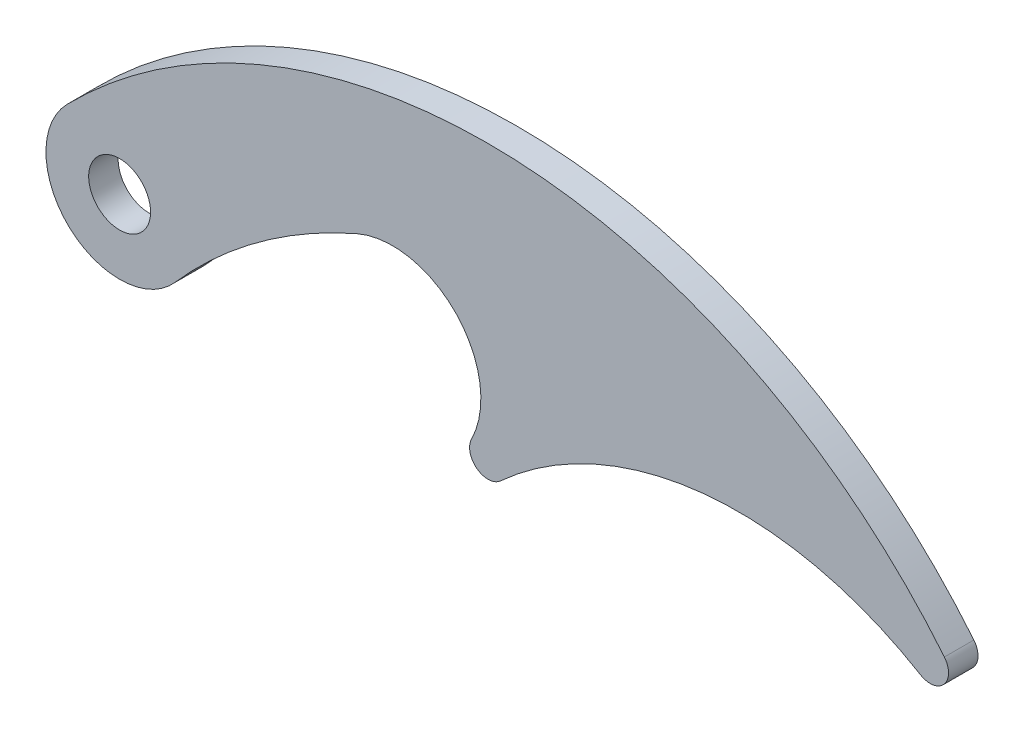
ISO-10303-21;
HEADER;
FILE_DESCRIPTION(('STEP AP214'),'2;1');
FILE_NAME('part.step','',(''),(''),'','','');
FILE_SCHEMA(('AUTOMOTIVE_DESIGN { 1 0 10303 214 1 1 1 1 }'));
ENDSEC;
DATA;
#1=APPLICATION_CONTEXT('core data for automotive mechanical design processes');
#2=APPLICATION_PROTOCOL_DEFINITION('international standard','automotive_design',2000,#1);
#3=PRODUCT_CONTEXT('',#1,'mechanical');
#4=PRODUCT('Part','Part','',(#3));
#5=PRODUCT_RELATED_PRODUCT_CATEGORY('part','',(#4));
#6=PRODUCT_DEFINITION_FORMATION('','',#4);
#7=PRODUCT_DEFINITION_CONTEXT('part definition',#1,'design');
#8=PRODUCT_DEFINITION('design','',#6,#7);
#9=PRODUCT_DEFINITION_SHAPE('','',#8);
#10=(LENGTH_UNIT() NAMED_UNIT(*) SI_UNIT(.MILLI.,.METRE.));
#11=(NAMED_UNIT(*) PLANE_ANGLE_UNIT() SI_UNIT($,.RADIAN.));
#12=(NAMED_UNIT(*) SI_UNIT($,.STERADIAN.) SOLID_ANGLE_UNIT());
#13=UNCERTAINTY_MEASURE_WITH_UNIT(LENGTH_MEASURE(1.E-05),#10,'distance_accuracy_value','');
#14=(GEOMETRIC_REPRESENTATION_CONTEXT(3) GLOBAL_UNCERTAINTY_ASSIGNED_CONTEXT((#13)) GLOBAL_UNIT_ASSIGNED_CONTEXT((#10,
#11,#12)) REPRESENTATION_CONTEXT('',''));
#15=CARTESIAN_POINT('',(0.,0.,0.));
#16=DIRECTION('',(0.,0.,1.));
#17=DIRECTION('',(1.,0.,0.));
#18=AXIS2_PLACEMENT_3D('',#15,#16,#17);
#19=CARTESIAN_POINT('',(25.,-3.,2.));
#20=DIRECTION('',(0.,0.,-1.));
#21=DIRECTION('',(-1.,0.,0.));
#22=AXIS2_PLACEMENT_3D('',#19,#20,#21);
#23=CYLINDRICAL_SURFACE('',#22,1.25000000000001);
#24=CARTESIAN_POINT('',(25.,-3.,0.));
#25=DIRECTION('',(0.,0.,1.));
#26=DIRECTION('',(1.,0.,0.));
#27=AXIS2_PLACEMENT_3D('',#24,#25,#26);
#28=CIRCLE('',#27,1.25000000000001);
#29=CARTESIAN_POINT('',(23.8818851238486,-2.44114480969659,0.));
#30=VERTEX_POINT('',#29);
#31=CARTESIAN_POINT('',(25.8423546751027,-3.92354675102705,0.));
#32=VERTEX_POINT('',#31);
#33=EDGE_CURVE('E127',#30,#32,#28,.T.);
#34=ORIENTED_EDGE('',*,*,#33,.T.);
#35=DIRECTION('',(0.,0.,-1.));
#36=VECTOR('',#35,1.);
#37=CARTESIAN_POINT('',(25.8423546751027,-3.92354675102705,2.));
#38=LINE('',#37,#36);
#39=CARTESIAN_POINT('',(25.8423546751027,-3.92354675102705,2.));
#40=VERTEX_POINT('',#39);
#41=EDGE_CURVE('E11',#40,#32,#38,.T.);
#42=ORIENTED_EDGE('',*,*,#41,.F.);
#43=CARTESIAN_POINT('',(25.,-3.,2.));
#44=DIRECTION('',(0.,0.,1.));
#45=DIRECTION('',(1.,0.,0.));
#46=AXIS2_PLACEMENT_3D('',#43,#44,#45);
#47=CIRCLE('',#46,1.25000000000001);
#48=CARTESIAN_POINT('',(23.8818851238486,-2.44114480969659,2.));
#49=VERTEX_POINT('',#48);
#50=EDGE_CURVE('E163',#49,#40,#47,.T.);
#51=ORIENTED_EDGE('',*,*,#50,.F.);
#52=DIRECTION('',(0.,0.,-1.));
#53=VECTOR('',#52,1.);
#54=CARTESIAN_POINT('',(23.8818851238486,-2.44114480969659,2.));
#55=LINE('',#54,#53);
#56=EDGE_CURVE('E50',#49,#30,#55,.T.);
#57=ORIENTED_EDGE('',*,*,#56,.T.);
#58=EDGE_LOOP('',(#34,#42,#51,#57));
#59=FACE_BOUND('',#58,.T.);
#60=ADVANCED_FACE('F33',(#59),#23,.T.);
#61=CARTESIAN_POINT('',(42.0155644370746,-21.6556443707464,2.));
#62=DIRECTION('',(0.,0.,-1.));
#63=DIRECTION('',(-1.,0.,0.));
#64=AXIS2_PLACEMENT_3D('',#61,#62,#63);
#65=CYLINDRICAL_SURFACE('',#64,24.);
#66=CARTESIAN_POINT('',(42.0155644370746,-21.6556443707464,0.));
#67=DIRECTION('',(0.,0.,1.));
#68=DIRECTION('',(1.,0.,0.));
#69=AXIS2_PLACEMENT_3D('',#66,#67,#68);
#70=CIRCLE('',#69,24.);
#71=CARTESIAN_POINT('',(54.3572061602512,-1.0720616025122,0.));
#72=VERTEX_POINT('',#71);
#73=EDGE_CURVE('E129',#32,#72,#70,.F.);
#74=ORIENTED_EDGE('',*,*,#73,.T.);
#75=DIRECTION('',(0.,0.,-1.));
#76=VECTOR('',#75,1.);
#77=CARTESIAN_POINT('',(54.3572061602512,-1.0720616025122,2.));
#78=LINE('',#77,#76);
#79=CARTESIAN_POINT('',(54.3572061602512,-1.0720616025122,2.));
#80=VERTEX_POINT('',#79);
#81=EDGE_CURVE('E42',#80,#72,#78,.T.);
#82=ORIENTED_EDGE('',*,*,#81,.F.);
#83=CARTESIAN_POINT('',(42.0155644370746,-21.6556443707464,2.));
#84=DIRECTION('',(0.,0.,1.));
#85=DIRECTION('',(1.,0.,0.));
#86=AXIS2_PLACEMENT_3D('',#83,#84,#85);
#87=CIRCLE('',#86,24.);
#88=EDGE_CURVE('E86',#40,#80,#87,.F.);
#89=ORIENTED_EDGE('',*,*,#88,.F.);
#90=ORIENTED_EDGE('',*,*,#41,.T.);
#91=EDGE_LOOP('',(#74,#82,#89,#90));
#92=FACE_BOUND('',#91,.T.);
#93=ADVANCED_FACE('F181',(#92),#65,.F.);
#94=CARTESIAN_POINT('',(55.,0.,2.));
#95=DIRECTION('',(0.,0.,-1.));
#96=DIRECTION('',(-1.,0.,0.));
#97=AXIS2_PLACEMENT_3D('',#94,#95,#96);
#98=CYLINDRICAL_SURFACE('',#97,1.25);
#99=CARTESIAN_POINT('',(55.,0.,0.));
#100=DIRECTION('',(0.,0.,1.));
#101=DIRECTION('',(1.,0.,0.));
#102=AXIS2_PLACEMENT_3D('',#99,#100,#101);
#103=CIRCLE('',#102,1.25);
#104=CARTESIAN_POINT('',(55.9682001466276,0.790625370242043,0.));
#105=VERTEX_POINT('',#104);
#106=EDGE_CURVE('E131',#72,#105,#103,.T.);
#107=ORIENTED_EDGE('',*,*,#106,.T.);
#108=DIRECTION('',(0.,0.,-1.));
#109=VECTOR('',#108,1.);
#110=CARTESIAN_POINT('',(55.9682001466276,0.790625370242043,2.));
#111=LINE('',#110,#109);
#112=CARTESIAN_POINT('',(55.9682001466276,0.790625370242043,2.));
#113=VERTEX_POINT('',#112);
#114=EDGE_CURVE('E147',#113,#105,#111,.T.);
#115=ORIENTED_EDGE('',*,*,#114,.F.);
#116=CARTESIAN_POINT('',(55.,0.,2.));
#117=DIRECTION('',(0.,0.,1.));
#118=DIRECTION('',(1.,0.,0.));
#119=AXIS2_PLACEMENT_3D('',#116,#117,#118);
#120=CIRCLE('',#119,1.25);
#121=EDGE_CURVE('E154',#80,#113,#120,.T.);
#122=ORIENTED_EDGE('',*,*,#121,.F.);
#123=ORIENTED_EDGE('',*,*,#81,.T.);
#124=EDGE_LOOP('',(#107,#115,#122,#123));
#125=FACE_BOUND('',#124,.T.);
#126=ADVANCED_FACE('F152',(#125),#98,.T.);
#127=CARTESIAN_POINT('',(24.9857954545455,-24.5093864775032,2.));
#128=DIRECTION('',(0.,0.,-1.));
#129=DIRECTION('',(-1.,0.,0.));
#130=AXIS2_PLACEMENT_3D('',#127,#128,#129);
#131=CYLINDRICAL_SURFACE('',#130,40.);
#132=CARTESIAN_POINT('',(24.9857954545455,-24.5093864775032,0.));
#133=DIRECTION('',(0.,0.,1.));
#134=DIRECTION('',(1.,0.,0.));
#135=AXIS2_PLACEMENT_3D('',#132,#133,#134);
#136=CIRCLE('',#135,40.);
#137=CARTESIAN_POINT('',(-3.56939935064935,3.50134092535759,0.));
#138=VERTEX_POINT('',#137);
#139=EDGE_CURVE('E134',#138,#105,#136,.F.);
#140=ORIENTED_EDGE('',*,*,#139,.F.);
#141=DIRECTION('',(0.,0.,-1.));
#142=VECTOR('',#141,1.);
#143=CARTESIAN_POINT('',(-3.56939935064935,3.50134092535759,2.));
#144=LINE('',#143,#142);
#145=CARTESIAN_POINT('',(-3.56939935064935,3.50134092535759,2.));
#146=VERTEX_POINT('',#145);
#147=EDGE_CURVE('E116',#146,#138,#144,.T.);
#148=ORIENTED_EDGE('',*,*,#147,.F.);
#149=CARTESIAN_POINT('',(24.9857954545455,-24.5093864775032,2.));
#150=DIRECTION('',(0.,0.,1.));
#151=DIRECTION('',(1.,0.,0.));
#152=AXIS2_PLACEMENT_3D('',#149,#150,#151);
#153=CIRCLE('',#152,40.);
#154=EDGE_CURVE('E106',#146,#113,#153,.F.);
#155=ORIENTED_EDGE('',*,*,#154,.T.);
#156=ORIENTED_EDGE('',*,*,#114,.T.);
#157=EDGE_LOOP('',(#140,#148,#155,#156));
#158=FACE_BOUND('',#157,.T.);
#159=ADVANCED_FACE('F159',(#158),#131,.T.);
#160=CARTESIAN_POINT('',(0.,0.,2.));
#161=DIRECTION('',(0.,0.,-1.));
#162=DIRECTION('',(-1.,0.,0.));
#163=AXIS2_PLACEMENT_3D('',#160,#161,#162);
#164=CYLINDRICAL_SURFACE('',#163,5.);
#165=CARTESIAN_POINT('',(0.,0.,0.));
#166=DIRECTION('',(0.,0.,1.));
#167=DIRECTION('',(1.,0.,0.));
#168=AXIS2_PLACEMENT_3D('',#165,#166,#167);
#169=CIRCLE('',#168,5.);
#170=CARTESIAN_POINT('',(3.76242897727272,-3.29304239131209,0.));
#171=VERTEX_POINT('',#170);
#172=EDGE_CURVE('E113',#138,#171,#169,.T.);
#173=ORIENTED_EDGE('',*,*,#172,.T.);
#174=DIRECTION('',(0.,0.,-1.));
#175=VECTOR('',#174,1.);
#176=CARTESIAN_POINT('',(3.76242897727272,-3.29304239131209,2.));
#177=LINE('',#176,#175);
#178=CARTESIAN_POINT('',(3.76242897727272,-3.29304239131209,2.));
#179=VERTEX_POINT('',#178);
#180=EDGE_CURVE('E110',#179,#171,#177,.T.);
#181=ORIENTED_EDGE('',*,*,#180,.F.);
#182=CARTESIAN_POINT('',(0.,0.,2.));
#183=DIRECTION('',(0.,0.,1.));
#184=DIRECTION('',(1.,0.,0.));
#185=AXIS2_PLACEMENT_3D('',#182,#183,#184);
#186=CIRCLE('',#185,5.);
#187=EDGE_CURVE('E99',#146,#179,#186,.T.);
#188=ORIENTED_EDGE('',*,*,#187,.F.);
#189=ORIENTED_EDGE('',*,*,#147,.T.);
#190=EDGE_LOOP('',(#173,#181,#188,#189));
#191=FACE_BOUND('',#190,.T.);
#192=ADVANCED_FACE('F111',(#191),#164,.T.);
#193=CARTESIAN_POINT('',(30.0994318181818,-26.3443391304968,2.));
#194=DIRECTION('',(0.,0.,-1.));
#195=DIRECTION('',(-1.,0.,0.));
#196=AXIS2_PLACEMENT_3D('',#193,#194,#195);
#197=CYLINDRICAL_SURFACE('',#196,35.);
#198=CARTESIAN_POINT('',(30.0994318181818,-26.3443391304968,0.));
#199=DIRECTION('',(0.,0.,1.));
#200=DIRECTION('',(1.,0.,0.));
#201=AXIS2_PLACEMENT_3D('',#198,#199,#200);
#202=CIRCLE('',#201,35.);
#203=CARTESIAN_POINT('',(16.1181410080064,5.74184960050249,0.));
#204=VERTEX_POINT('',#203);
#205=EDGE_CURVE('E138',#171,#204,#202,.F.);
#206=ORIENTED_EDGE('',*,*,#205,.T.);
#207=DIRECTION('',(0.,0.,-1.));
#208=VECTOR('',#207,1.);
#209=CARTESIAN_POINT('',(16.1181410080064,5.74184960050249,2.));
#210=LINE('',#209,#208);
#211=CARTESIAN_POINT('',(16.1181410080064,5.74184960050249,2.));
#212=VERTEX_POINT('',#211);
#213=EDGE_CURVE('E74',#212,#204,#210,.T.);
#214=ORIENTED_EDGE('',*,*,#213,.F.);
#215=CARTESIAN_POINT('',(30.0994318181818,-26.3443391304968,2.));
#216=DIRECTION('',(0.,0.,1.));
#217=DIRECTION('',(1.,0.,0.));
#218=AXIS2_PLACEMENT_3D('',#215,#216,#217);
#219=CIRCLE('',#218,35.);
#220=EDGE_CURVE('E104',#179,#212,#219,.F.);
#221=ORIENTED_EDGE('',*,*,#220,.F.);
#222=ORIENTED_EDGE('',*,*,#180,.T.);
#223=EDGE_LOOP('',(#206,#214,#221,#222));
#224=FACE_BOUND('',#223,.T.);
#225=ADVANCED_FACE('F118',(#224),#197,.F.);
#226=CARTESIAN_POINT('',(0.,0.,2.));
#227=DIRECTION('',(0.,0.,-1.));
#228=DIRECTION('',(-1.,0.,0.));
#229=AXIS2_PLACEMENT_3D('',#226,#227,#228);
#230=CYLINDRICAL_SURFACE('',#229,2.1);
#231=CARTESIAN_POINT('',(0.,0.,2.));
#232=DIRECTION('',(0.,0.,1.));
#233=DIRECTION('',(1.,0.,0.));
#234=AXIS2_PLACEMENT_3D('',#231,#232,#233);
#235=CIRCLE('',#234,2.1);
#236=CARTESIAN_POINT('',(2.1,0.,2.));
#237=VERTEX_POINT('',#236);
#238=EDGE_CURVE('E143',#237,#237,#235,.T.);
#239=ORIENTED_EDGE('',*,*,#238,.T.);
#240=EDGE_LOOP('',(#239));
#241=FACE_BOUND('',#240,.T.);
#242=CARTESIAN_POINT('',(0.,0.,0.));
#243=DIRECTION('',(0.,0.,1.));
#244=DIRECTION('',(1.,0.,0.));
#245=AXIS2_PLACEMENT_3D('',#242,#243,#244);
#246=CIRCLE('',#245,2.1);
#247=CARTESIAN_POINT('',(2.1,0.,0.));
#248=VERTEX_POINT('',#247);
#249=EDGE_CURVE('E124',#248,#248,#246,.T.);
#250=ORIENTED_EDGE('',*,*,#249,.F.);
#251=EDGE_LOOP('',(#250));
#252=FACE_BOUND('',#251,.T.);
#253=ADVANCED_FACE('F35',(#241,#252),#230,.F.);
#254=CARTESIAN_POINT('',(18.5149337183222,0.241360103759755,2.));
#255=DIRECTION('',(0.,0.,-1.));
#256=DIRECTION('',(-1.,0.,0.));
#257=AXIS2_PLACEMENT_3D('',#254,#255,#256);
#258=CYLINDRICAL_SURFACE('',#257,5.99999999999999);
#259=CARTESIAN_POINT('',(18.5149337183222,0.241360103759755,0.));
#260=DIRECTION('',(0.,0.,1.));
#261=DIRECTION('',(1.,0.,0.));
#262=AXIS2_PLACEMENT_3D('',#259,#260,#261);
#263=CIRCLE('',#262,5.99999999999999);
#264=EDGE_CURVE('E140',#30,#204,#263,.T.);
#265=ORIENTED_EDGE('',*,*,#264,.F.);
#266=ORIENTED_EDGE('',*,*,#56,.F.);
#267=CARTESIAN_POINT('',(18.5149337183222,0.241360103759755,2.));
#268=DIRECTION('',(0.,0.,1.));
#269=DIRECTION('',(1.,0.,0.));
#270=AXIS2_PLACEMENT_3D('',#267,#268,#269);
#271=CIRCLE('',#270,5.99999999999999);
#272=EDGE_CURVE('E119',#49,#212,#271,.T.);
#273=ORIENTED_EDGE('',*,*,#272,.T.);
#274=ORIENTED_EDGE('',*,*,#213,.T.);
#275=EDGE_LOOP('',(#265,#266,#273,#274));
#276=FACE_BOUND('',#275,.T.);
#277=ADVANCED_FACE('F171',(#276),#258,.F.);
#278=CARTESIAN_POINT('',(0.,0.,2.));
#279=DIRECTION('',(0.,0.,1.));
#280=DIRECTION('',(1.,0.,0.));
#281=AXIS2_PLACEMENT_3D('',#278,#279,#280);
#282=PLANE('',#281);
#283=ORIENTED_EDGE('',*,*,#238,.F.);
#284=EDGE_LOOP('',(#283));
#285=FACE_BOUND('',#284,.T.);
#286=ORIENTED_EDGE('',*,*,#50,.T.);
#287=ORIENTED_EDGE('',*,*,#88,.T.);
#288=ORIENTED_EDGE('',*,*,#121,.T.);
#289=ORIENTED_EDGE('',*,*,#154,.F.);
#290=ORIENTED_EDGE('',*,*,#187,.T.);
#291=ORIENTED_EDGE('',*,*,#220,.T.);
#292=ORIENTED_EDGE('',*,*,#272,.F.);
#293=EDGE_LOOP('',(#286,#287,#288,#289,#290,#291,#292));
#294=FACE_BOUND('',#293,.T.);
#295=ADVANCED_FACE('F101',(#285,#294),#282,.T.);
#296=CARTESIAN_POINT('',(0.,0.,0.));
#297=DIRECTION('',(0.,0.,1.));
#298=DIRECTION('',(1.,0.,0.));
#299=AXIS2_PLACEMENT_3D('',#296,#297,#298);
#300=PLANE('',#299);
#301=ORIENTED_EDGE('',*,*,#249,.T.);
#302=EDGE_LOOP('',(#301));
#303=FACE_BOUND('',#302,.T.);
#304=ORIENTED_EDGE('',*,*,#33,.F.);
#305=ORIENTED_EDGE('',*,*,#264,.T.);
#306=ORIENTED_EDGE('',*,*,#205,.F.);
#307=ORIENTED_EDGE('',*,*,#172,.F.);
#308=ORIENTED_EDGE('',*,*,#139,.T.);
#309=ORIENTED_EDGE('',*,*,#106,.F.);
#310=ORIENTED_EDGE('',*,*,#73,.F.);
#311=EDGE_LOOP('',(#304,#305,#306,#307,#308,#309,#310));
#312=FACE_BOUND('',#311,.T.);
#313=ADVANCED_FACE('F156',(#303,#312),#300,.F.);
#314=CLOSED_SHELL('',(#60,#93,#126,#159,#192,#225,#253,#277,#295,#313));
#315=MANIFOLD_SOLID_BREP('B2',#314);
#316=ADVANCED_BREP_SHAPE_REPRESENTATION('',(#18,#315),#14);
#317=SHAPE_DEFINITION_REPRESENTATION(#9,#316);
ENDSEC;
END-ISO-10303-21;
